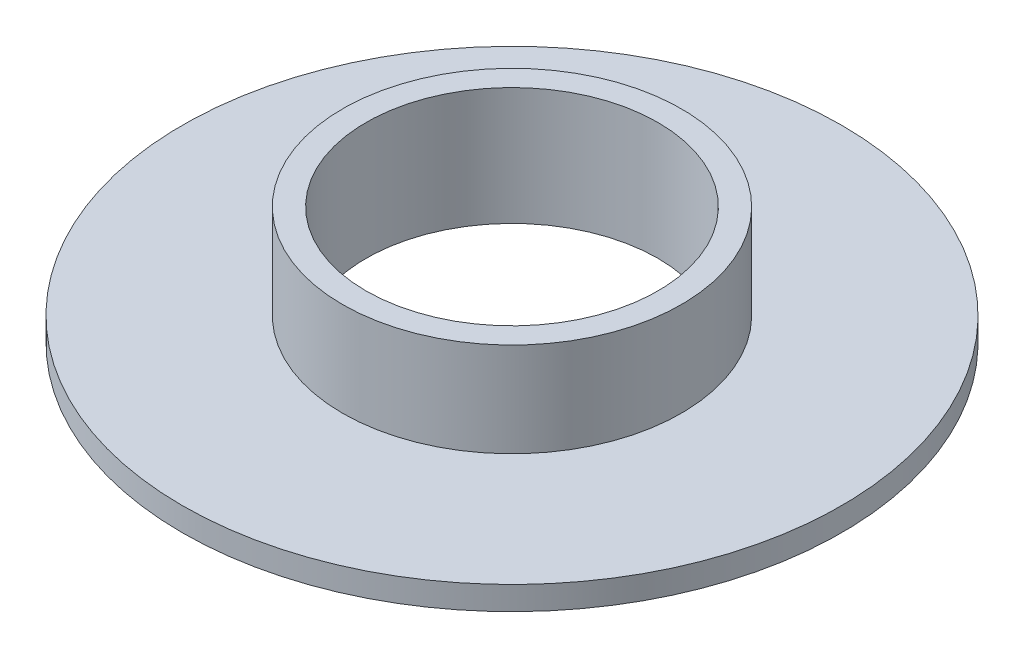
ISO-10303-21;
HEADER;
FILE_DESCRIPTION(('STEP AP214'),'2;1');
FILE_NAME('part.step','',(''),(''),'','','');
FILE_SCHEMA(('AUTOMOTIVE_DESIGN { 1 0 10303 214 1 1 1 1 }'));
ENDSEC;
DATA;
#1=APPLICATION_CONTEXT('core data for automotive mechanical design processes');
#2=APPLICATION_PROTOCOL_DEFINITION('international standard','automotive_design',2000,#1);
#3=PRODUCT_CONTEXT('',#1,'mechanical');
#4=PRODUCT('Part','Part','',(#3));
#5=PRODUCT_RELATED_PRODUCT_CATEGORY('part','',(#4));
#6=PRODUCT_DEFINITION_FORMATION('','',#4);
#7=PRODUCT_DEFINITION_CONTEXT('part definition',#1,'design');
#8=PRODUCT_DEFINITION('design','',#6,#7);
#9=PRODUCT_DEFINITION_SHAPE('','',#8);
#10=(LENGTH_UNIT() NAMED_UNIT(*) SI_UNIT(.MILLI.,.METRE.));
#11=(NAMED_UNIT(*) PLANE_ANGLE_UNIT() SI_UNIT($,.RADIAN.));
#12=(NAMED_UNIT(*) SI_UNIT($,.STERADIAN.) SOLID_ANGLE_UNIT());
#13=UNCERTAINTY_MEASURE_WITH_UNIT(LENGTH_MEASURE(1.E-05),#10,'distance_accuracy_value','');
#14=(GEOMETRIC_REPRESENTATION_CONTEXT(3) GLOBAL_UNCERTAINTY_ASSIGNED_CONTEXT((#13)) GLOBAL_UNIT_ASSIGNED_CONTEXT((#10,
#11,#12)) REPRESENTATION_CONTEXT('',''));
#15=CARTESIAN_POINT('',(0.,0.,0.));
#16=DIRECTION('',(0.,0.,1.));
#17=DIRECTION('',(1.,0.,0.));
#18=AXIS2_PLACEMENT_3D('',#15,#16,#17);
#19=CARTESIAN_POINT('',(0.,0.,0.));
#20=DIRECTION('',(0.,1.,0.));
#21=DIRECTION('',(0.,0.,1.));
#22=AXIS2_PLACEMENT_3D('',#19,#20,#21);
#23=PLANE('',#22);
#24=CARTESIAN_POINT('',(0.,0.,0.));
#25=DIRECTION('',(0.,1.,0.));
#26=DIRECTION('',(0.,0.,1.));
#27=AXIS2_PLACEMENT_3D('',#24,#25,#26);
#28=CIRCLE('',#27,31.);
#29=CARTESIAN_POINT('',(0.,0.,31.));
#30=VERTEX_POINT('',#29);
#31=EDGE_CURVE('E34',#30,#30,#28,.T.);
#32=ORIENTED_EDGE('',*,*,#31,.T.);
#33=EDGE_LOOP('',(#32));
#34=FACE_BOUND('',#33,.T.);
#35=CARTESIAN_POINT('',(0.,0.,0.));
#36=DIRECTION('',(0.,1.,0.));
#37=DIRECTION('',(0.,0.,1.));
#38=AXIS2_PLACEMENT_3D('',#35,#36,#37);
#39=CIRCLE('',#38,70.);
#40=CARTESIAN_POINT('',(0.,0.,70.));
#41=VERTEX_POINT('',#40);
#42=EDGE_CURVE('E10',#41,#41,#39,.T.);
#43=ORIENTED_EDGE('',*,*,#42,.F.);
#44=EDGE_LOOP('',(#43));
#45=FACE_BOUND('',#44,.T.);
#46=ADVANCED_FACE('F31',(#34,#45),#23,.F.);
#47=CARTESIAN_POINT('',(0.,4.99999999999999,0.));
#48=DIRECTION('',(0.,1.,0.));
#49=DIRECTION('',(0.,0.,1.));
#50=AXIS2_PLACEMENT_3D('',#47,#48,#49);
#51=CYLINDRICAL_SURFACE('',#50,70.);
#52=CARTESIAN_POINT('',(0.,5.,0.));
#53=DIRECTION('',(0.,1.,0.));
#54=DIRECTION('',(0.,0.,1.));
#55=AXIS2_PLACEMENT_3D('',#52,#53,#54);
#56=CIRCLE('',#55,70.);
#57=CARTESIAN_POINT('',(0.,5.,70.));
#58=VERTEX_POINT('',#57);
#59=EDGE_CURVE('E38',#58,#58,#56,.T.);
#60=ORIENTED_EDGE('',*,*,#59,.F.);
#61=EDGE_LOOP('',(#60));
#62=FACE_BOUND('',#61,.T.);
#63=ORIENTED_EDGE('',*,*,#42,.T.);
#64=EDGE_LOOP('',(#63));
#65=FACE_BOUND('',#64,.T.);
#66=ADVANCED_FACE('F70',(#62,#65),#51,.T.);
#67=CARTESIAN_POINT('',(0.,5.,-70.));
#68=DIRECTION('',(0.,-1.,0.));
#69=DIRECTION('',(0.,0.,-1.));
#70=AXIS2_PLACEMENT_3D('',#67,#68,#69);
#71=PLANE('',#70);
#72=CARTESIAN_POINT('',(0.,5.,0.));
#73=DIRECTION('',(0.,1.,0.));
#74=DIRECTION('',(0.,0.,1.));
#75=AXIS2_PLACEMENT_3D('',#72,#73,#74);
#76=CIRCLE('',#75,36.);
#77=CARTESIAN_POINT('',(0.,5.,36.));
#78=VERTEX_POINT('',#77);
#79=EDGE_CURVE('E42',#78,#78,#76,.T.);
#80=ORIENTED_EDGE('',*,*,#79,.F.);
#81=EDGE_LOOP('',(#80));
#82=FACE_BOUND('',#81,.T.);
#83=ORIENTED_EDGE('',*,*,#59,.T.);
#84=EDGE_LOOP('',(#83));
#85=FACE_BOUND('',#84,.T.);
#86=ADVANCED_FACE('F74',(#82,#85),#71,.F.);
#87=CARTESIAN_POINT('',(0.,4.99999999999999,0.));
#88=DIRECTION('',(0.,1.,0.));
#89=DIRECTION('',(0.,0.,1.));
#90=AXIS2_PLACEMENT_3D('',#87,#88,#89);
#91=CYLINDRICAL_SURFACE('',#90,36.);
#92=CARTESIAN_POINT('',(0.,25.,0.));
#93=DIRECTION('',(0.,1.,0.));
#94=DIRECTION('',(0.,0.,1.));
#95=AXIS2_PLACEMENT_3D('',#92,#93,#94);
#96=CIRCLE('',#95,36.);
#97=CARTESIAN_POINT('',(0.,25.,36.));
#98=VERTEX_POINT('',#97);
#99=EDGE_CURVE('E47',#98,#98,#96,.T.);
#100=ORIENTED_EDGE('',*,*,#99,.F.);
#101=EDGE_LOOP('',(#100));
#102=FACE_BOUND('',#101,.T.);
#103=ORIENTED_EDGE('',*,*,#79,.T.);
#104=EDGE_LOOP('',(#103));
#105=FACE_BOUND('',#104,.T.);
#106=ADVANCED_FACE('F66',(#102,#105),#91,.T.);
#107=CARTESIAN_POINT('',(0.,25.,-36.));
#108=DIRECTION('',(0.,-1.,0.));
#109=DIRECTION('',(0.,0.,-1.));
#110=AXIS2_PLACEMENT_3D('',#107,#108,#109);
#111=PLANE('',#110);
#112=CARTESIAN_POINT('',(0.,25.,0.));
#113=DIRECTION('',(0.,1.,0.));
#114=DIRECTION('',(0.,0.,1.));
#115=AXIS2_PLACEMENT_3D('',#112,#113,#114);
#116=CIRCLE('',#115,31.);
#117=CARTESIAN_POINT('',(0.,25.,31.));
#118=VERTEX_POINT('',#117);
#119=EDGE_CURVE('E50',#118,#118,#116,.T.);
#120=ORIENTED_EDGE('',*,*,#119,.F.);
#121=EDGE_LOOP('',(#120));
#122=FACE_BOUND('',#121,.T.);
#123=ORIENTED_EDGE('',*,*,#99,.T.);
#124=EDGE_LOOP('',(#123));
#125=FACE_BOUND('',#124,.T.);
#126=ADVANCED_FACE('F61',(#122,#125),#111,.F.);
#127=CARTESIAN_POINT('',(0.,4.99999999999999,0.));
#128=DIRECTION('',(0.,1.,0.));
#129=DIRECTION('',(0.,0.,1.));
#130=AXIS2_PLACEMENT_3D('',#127,#128,#129);
#131=CYLINDRICAL_SURFACE('',#130,31.);
#132=ORIENTED_EDGE('',*,*,#119,.T.);
#133=EDGE_LOOP('',(#132));
#134=FACE_BOUND('',#133,.T.);
#135=ORIENTED_EDGE('',*,*,#31,.F.);
#136=EDGE_LOOP('',(#135));
#137=FACE_BOUND('',#136,.T.);
#138=ADVANCED_FACE('F59',(#134,#137),#131,.F.);
#139=CLOSED_SHELL('',(#46,#66,#86,#106,#126,#138));
#140=MANIFOLD_SOLID_BREP('B2',#139);
#141=ADVANCED_BREP_SHAPE_REPRESENTATION('',(#18,#140),#14);
#142=SHAPE_DEFINITION_REPRESENTATION(#9,#141);
ENDSEC;
END-ISO-10303-21;
